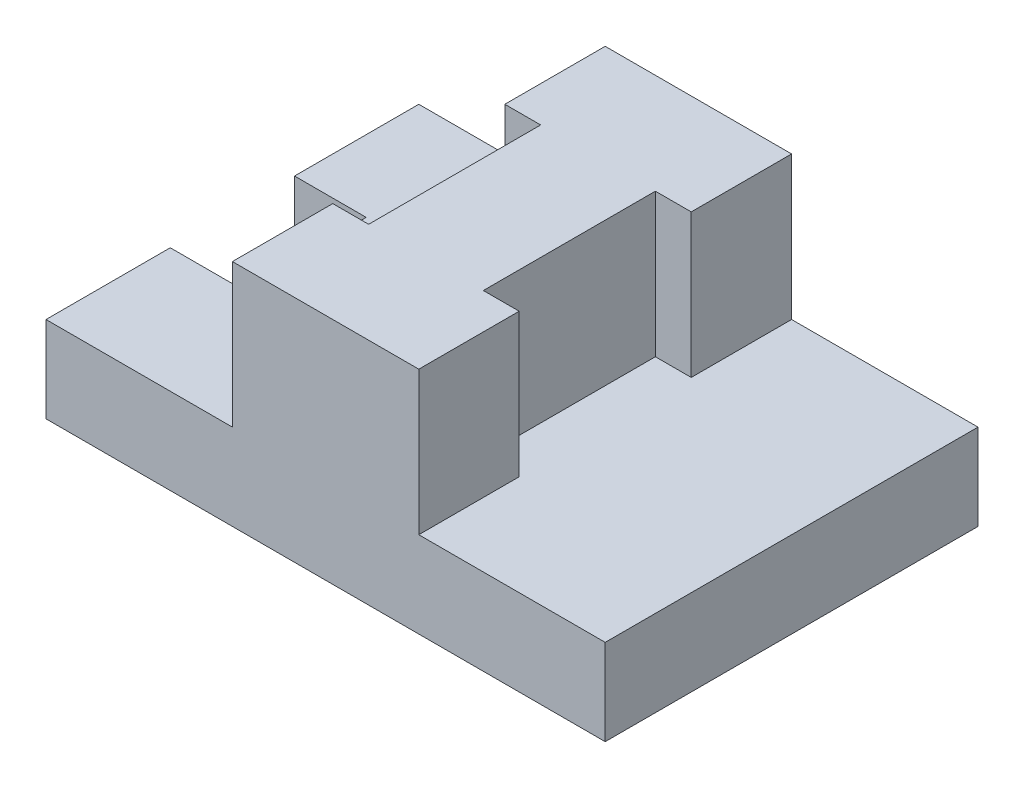
ISO-10303-21;
HEADER;
FILE_DESCRIPTION(('STEP AP214'),'2;1');
FILE_NAME('part.step','',(''),(''),'','','');
FILE_SCHEMA(('AUTOMOTIVE_DESIGN { 1 0 10303 214 1 1 1 1 }'));
ENDSEC;
DATA;
#1=APPLICATION_CONTEXT('core data for automotive mechanical design processes');
#2=APPLICATION_PROTOCOL_DEFINITION('international standard','automotive_design',2000,#1);
#3=PRODUCT_CONTEXT('',#1,'mechanical');
#4=PRODUCT('Part','Part','',(#3));
#5=PRODUCT_RELATED_PRODUCT_CATEGORY('part','',(#4));
#6=PRODUCT_DEFINITION_FORMATION('','',#4);
#7=PRODUCT_DEFINITION_CONTEXT('part definition',#1,'design');
#8=PRODUCT_DEFINITION('design','',#6,#7);
#9=PRODUCT_DEFINITION_SHAPE('','',#8);
#10=(LENGTH_UNIT() NAMED_UNIT(*) SI_UNIT(.MILLI.,.METRE.));
#11=(NAMED_UNIT(*) PLANE_ANGLE_UNIT() SI_UNIT($,.RADIAN.));
#12=(NAMED_UNIT(*) SI_UNIT($,.STERADIAN.) SOLID_ANGLE_UNIT());
#13=UNCERTAINTY_MEASURE_WITH_UNIT(LENGTH_MEASURE(1.E-05),#10,'distance_accuracy_value','');
#14=(GEOMETRIC_REPRESENTATION_CONTEXT(3) GLOBAL_UNCERTAINTY_ASSIGNED_CONTEXT((#13)) GLOBAL_UNIT_ASSIGNED_CONTEXT((#10,
#11,#12)) REPRESENTATION_CONTEXT('',''));
#15=CARTESIAN_POINT('',(0.,0.,0.));
#16=DIRECTION('',(0.,0.,1.));
#17=DIRECTION('',(1.,0.,0.));
#18=AXIS2_PLACEMENT_3D('',#15,#16,#17);
#19=CARTESIAN_POINT('',(0.,12.,-29.9759975651244));
#20=DIRECTION('',(0.,0.,1.));
#21=DIRECTION('',(1.,0.,0.));
#22=AXIS2_PLACEMENT_3D('',#19,#20,#21);
#23=PLANE('',#22);
#24=DIRECTION('',(-1.,0.,0.));
#25=VECTOR('',#24,1.);
#26=CARTESIAN_POINT('',(0.,0.,-29.9759975651244));
#27=LINE('',#26,#25);
#28=CARTESIAN_POINT('',(25.2402240596929,0.,-29.9759975651244));
#29=VERTEX_POINT('',#28);
#30=CARTESIAN_POINT('',(-52.7597759403071,0.,-29.9759975651244));
#31=VERTEX_POINT('',#30);
#32=EDGE_CURVE('E307',#29,#31,#27,.T.);
#33=ORIENTED_EDGE('',*,*,#32,.T.);
#34=DIRECTION('',(0.,-1.,0.));
#35=VECTOR('',#34,1.);
#36=CARTESIAN_POINT('',(-52.7597759403071,12.,-29.9759975651244));
#37=LINE('',#36,#35);
#38=CARTESIAN_POINT('',(-52.7597759403071,12.,-29.9759975651244));
#39=VERTEX_POINT('',#38);
#40=EDGE_CURVE('E11',#39,#31,#37,.T.);
#41=ORIENTED_EDGE('',*,*,#40,.F.);
#42=DIRECTION('',(-1.,0.,0.));
#43=VECTOR('',#42,1.);
#44=CARTESIAN_POINT('',(0.,12.,-29.9759975651244));
#45=LINE('',#44,#43);
#46=CARTESIAN_POINT('',(-26.7597759403071,12.,-29.9759975651244));
#47=VERTEX_POINT('',#46);
#48=EDGE_CURVE('E314',#47,#39,#45,.T.);
#49=ORIENTED_EDGE('',*,*,#48,.F.);
#50=DIRECTION('',(0.,-1.,0.));
#51=VECTOR('',#50,1.);
#52=CARTESIAN_POINT('',(-26.7597759403071,32.,-29.9759975651244));
#53=LINE('',#52,#51);
#54=CARTESIAN_POINT('',(-26.7597759403071,32.,-29.9759975651244));
#55=VERTEX_POINT('',#54);
#56=EDGE_CURVE('E297',#55,#47,#53,.T.);
#57=ORIENTED_EDGE('',*,*,#56,.F.);
#58=DIRECTION('',(-1.,0.,0.));
#59=VECTOR('',#58,1.);
#60=CARTESIAN_POINT('',(0.,32.,-29.9759975651244));
#61=LINE('',#60,#59);
#62=CARTESIAN_POINT('',(-0.759775940307066,32.,-29.9759975651244));
#63=VERTEX_POINT('',#62);
#64=EDGE_CURVE('E228',#63,#55,#61,.T.);
#65=ORIENTED_EDGE('',*,*,#64,.F.);
#66=DIRECTION('',(0.,-1.,0.));
#67=VECTOR('',#66,1.);
#68=CARTESIAN_POINT('',(-0.759775940307066,32.,-29.9759975651244));
#69=LINE('',#68,#67);
#70=CARTESIAN_POINT('',(-0.759775940307066,12.,-29.9759975651244));
#71=VERTEX_POINT('',#70);
#72=EDGE_CURVE('E301',#63,#71,#69,.T.);
#73=ORIENTED_EDGE('',*,*,#72,.T.);
#74=DIRECTION('',(-1.,0.,0.));
#75=VECTOR('',#74,1.);
#76=CARTESIAN_POINT('',(0.,12.,-29.9759975651244));
#77=LINE('',#76,#75);
#78=CARTESIAN_POINT('',(25.2402240596929,12.,-29.9759975651244));
#79=VERTEX_POINT('',#78);
#80=EDGE_CURVE('E211',#79,#71,#77,.T.);
#81=ORIENTED_EDGE('',*,*,#80,.F.);
#82=DIRECTION('',(0.,-1.,0.));
#83=VECTOR('',#82,1.);
#84=CARTESIAN_POINT('',(25.2402240596929,12.,-29.9759975651244));
#85=LINE('',#84,#83);
#86=EDGE_CURVE('E205',#79,#29,#85,.T.);
#87=ORIENTED_EDGE('',*,*,#86,.T.);
#88=EDGE_LOOP('',(#33,#41,#49,#57,#65,#73,#81,#87));
#89=FACE_BOUND('',#88,.T.);
#90=ADVANCED_FACE('F41',(#89),#23,.F.);
#91=CARTESIAN_POINT('',(-52.7597759403071,12.,0.));
#92=DIRECTION('',(1.,0.,0.));
#93=DIRECTION('',(0.,0.,-1.));
#94=AXIS2_PLACEMENT_3D('',#91,#92,#93);
#95=PLANE('',#94);
#96=DIRECTION('',(0.,0.,1.));
#97=VECTOR('',#96,1.);
#98=CARTESIAN_POINT('',(-52.7597759403071,0.,0.));
#99=LINE('',#98,#97);
#100=CARTESIAN_POINT('',(-52.7597759403071,0.,-12.6426642317911));
#101=VERTEX_POINT('',#100);
#102=EDGE_CURVE('E347',#31,#101,#99,.T.);
#103=ORIENTED_EDGE('',*,*,#102,.T.);
#104=DIRECTION('',(0.,-1.,0.));
#105=VECTOR('',#104,1.);
#106=CARTESIAN_POINT('',(-52.7597759403071,12.,-12.6426642317911));
#107=LINE('',#106,#105);
#108=CARTESIAN_POINT('',(-52.7597759403071,12.,-12.6426642317911));
#109=VERTEX_POINT('',#108);
#110=EDGE_CURVE('E49',#109,#101,#107,.T.);
#111=ORIENTED_EDGE('',*,*,#110,.F.);
#112=DIRECTION('',(0.,0.,1.));
#113=VECTOR('',#112,1.);
#114=CARTESIAN_POINT('',(-52.7597759403071,12.,0.));
#115=LINE('',#114,#113);
#116=EDGE_CURVE('E317',#39,#109,#115,.T.);
#117=ORIENTED_EDGE('',*,*,#116,.F.);
#118=ORIENTED_EDGE('',*,*,#40,.T.);
#119=EDGE_LOOP('',(#103,#111,#117,#118));
#120=FACE_BOUND('',#119,.T.);
#121=ADVANCED_FACE('F407',(#120),#95,.F.);
#122=CARTESIAN_POINT('',(0.,12.,-12.6426642317911));
#123=DIRECTION('',(0.,0.,-1.));
#124=DIRECTION('',(-1.,0.,0.));
#125=AXIS2_PLACEMENT_3D('',#122,#123,#124);
#126=PLANE('',#125);
#127=DIRECTION('',(1.,0.,0.));
#128=VECTOR('',#127,1.);
#129=CARTESIAN_POINT('',(0.,0.,-12.6426642317911));
#130=LINE('',#129,#128);
#131=CARTESIAN_POINT('',(-42.7597759403071,0.,-12.6426642317911));
#132=VERTEX_POINT('',#131);
#133=EDGE_CURVE('E350',#101,#132,#130,.T.);
#134=ORIENTED_EDGE('',*,*,#133,.T.);
#135=DIRECTION('',(0.,-1.,0.));
#136=VECTOR('',#135,1.);
#137=CARTESIAN_POINT('',(-42.7597759403071,12.,-12.6426642317911));
#138=LINE('',#137,#136);
#139=CARTESIAN_POINT('',(-42.7597759403071,12.,-12.6426642317911));
#140=VERTEX_POINT('',#139);
#141=EDGE_CURVE('E374',#140,#132,#138,.T.);
#142=ORIENTED_EDGE('',*,*,#141,.F.);
#143=DIRECTION('',(1.,0.,0.));
#144=VECTOR('',#143,1.);
#145=CARTESIAN_POINT('',(0.,12.,-12.6426642317911));
#146=LINE('',#145,#144);
#147=EDGE_CURVE('E320',#109,#140,#146,.T.);
#148=ORIENTED_EDGE('',*,*,#147,.F.);
#149=ORIENTED_EDGE('',*,*,#110,.T.);
#150=EDGE_LOOP('',(#134,#142,#148,#149));
#151=FACE_BOUND('',#150,.T.);
#152=ADVANCED_FACE('F383',(#151),#126,.F.);
#153=CARTESIAN_POINT('',(-42.7597759403071,12.,0.));
#154=DIRECTION('',(1.,0.,0.));
#155=DIRECTION('',(0.,0.,-1.));
#156=AXIS2_PLACEMENT_3D('',#153,#154,#155);
#157=PLANE('',#156);
#158=DIRECTION('',(0.,0.,1.));
#159=VECTOR('',#158,1.);
#160=CARTESIAN_POINT('',(-42.7597759403071,0.,0.));
#161=LINE('',#160,#159);
#162=CARTESIAN_POINT('',(-42.7597759403071,0.,4.69066910154227));
#163=VERTEX_POINT('',#162);
#164=EDGE_CURVE('E353',#132,#163,#161,.T.);
#165=ORIENTED_EDGE('',*,*,#164,.T.);
#166=DIRECTION('',(0.,-1.,0.));
#167=VECTOR('',#166,1.);
#168=CARTESIAN_POINT('',(-42.7597759403071,12.,4.69066910154227));
#169=LINE('',#168,#167);
#170=CARTESIAN_POINT('',(-42.7597759403071,12.,4.69066910154227));
#171=VERTEX_POINT('',#170);
#172=EDGE_CURVE('E370',#171,#163,#169,.T.);
#173=ORIENTED_EDGE('',*,*,#172,.F.);
#174=DIRECTION('',(0.,0.,1.));
#175=VECTOR('',#174,1.);
#176=CARTESIAN_POINT('',(-42.7597759403071,12.,0.));
#177=LINE('',#176,#175);
#178=EDGE_CURVE('E323',#140,#171,#177,.T.);
#179=ORIENTED_EDGE('',*,*,#178,.F.);
#180=ORIENTED_EDGE('',*,*,#141,.T.);
#181=EDGE_LOOP('',(#165,#173,#179,#180));
#182=FACE_BOUND('',#181,.T.);
#183=ADVANCED_FACE('F395',(#182),#157,.F.);
#184=CARTESIAN_POINT('',(0.,12.,4.69066910154227));
#185=DIRECTION('',(0.,0.,1.));
#186=DIRECTION('',(1.,0.,0.));
#187=AXIS2_PLACEMENT_3D('',#184,#185,#186);
#188=PLANE('',#187);
#189=DIRECTION('',(-1.,0.,0.));
#190=VECTOR('',#189,1.);
#191=CARTESIAN_POINT('',(0.,0.,4.69066910154227));
#192=LINE('',#191,#190);
#193=CARTESIAN_POINT('',(-52.7597759403071,0.,4.69066910154227));
#194=VERTEX_POINT('',#193);
#195=EDGE_CURVE('E356',#163,#194,#192,.T.);
#196=ORIENTED_EDGE('',*,*,#195,.T.);
#197=DIRECTION('',(0.,-1.,0.));
#198=VECTOR('',#197,1.);
#199=CARTESIAN_POINT('',(-52.7597759403071,12.,4.69066910154227));
#200=LINE('',#199,#198);
#201=CARTESIAN_POINT('',(-52.7597759403071,12.,4.69066910154227));
#202=VERTEX_POINT('',#201);
#203=EDGE_CURVE('E366',#202,#194,#200,.T.);
#204=ORIENTED_EDGE('',*,*,#203,.F.);
#205=DIRECTION('',(-1.,0.,0.));
#206=VECTOR('',#205,1.);
#207=CARTESIAN_POINT('',(0.,12.,4.69066910154227));
#208=LINE('',#207,#206);
#209=EDGE_CURVE('E326',#171,#202,#208,.T.);
#210=ORIENTED_EDGE('',*,*,#209,.F.);
#211=ORIENTED_EDGE('',*,*,#172,.T.);
#212=EDGE_LOOP('',(#196,#204,#210,#211));
#213=FACE_BOUND('',#212,.T.);
#214=ADVANCED_FACE('F399',(#213),#188,.F.);
#215=CARTESIAN_POINT('',(-52.7597759403071,12.,0.));
#216=DIRECTION('',(1.,0.,0.));
#217=DIRECTION('',(0.,0.,-1.));
#218=AXIS2_PLACEMENT_3D('',#215,#216,#217);
#219=PLANE('',#218);
#220=DIRECTION('',(0.,0.,1.));
#221=VECTOR('',#220,1.);
#222=CARTESIAN_POINT('',(-52.7597759403071,0.,0.));
#223=LINE('',#222,#221);
#224=CARTESIAN_POINT('',(-52.7597759403071,0.,22.0240024348756));
#225=VERTEX_POINT('',#224);
#226=EDGE_CURVE('E359',#194,#225,#223,.T.);
#227=ORIENTED_EDGE('',*,*,#226,.T.);
#228=DIRECTION('',(0.,-1.,0.));
#229=VECTOR('',#228,1.);
#230=CARTESIAN_POINT('',(-52.7597759403071,12.,22.0240024348756));
#231=LINE('',#230,#229);
#232=CARTESIAN_POINT('',(-52.7597759403071,12.,22.0240024348756));
#233=VERTEX_POINT('',#232);
#234=EDGE_CURVE('E344',#233,#225,#231,.T.);
#235=ORIENTED_EDGE('',*,*,#234,.F.);
#236=DIRECTION('',(0.,0.,1.));
#237=VECTOR('',#236,1.);
#238=CARTESIAN_POINT('',(-52.7597759403071,12.,0.));
#239=LINE('',#238,#237);
#240=EDGE_CURVE('E329',#202,#233,#239,.T.);
#241=ORIENTED_EDGE('',*,*,#240,.F.);
#242=ORIENTED_EDGE('',*,*,#203,.T.);
#243=EDGE_LOOP('',(#227,#235,#241,#242));
#244=FACE_BOUND('',#243,.T.);
#245=ADVANCED_FACE('F411',(#244),#219,.F.);
#246=CARTESIAN_POINT('',(0.,12.,22.0240024348756));
#247=DIRECTION('',(0.,0.,-1.));
#248=DIRECTION('',(-1.,0.,0.));
#249=AXIS2_PLACEMENT_3D('',#246,#247,#248);
#250=PLANE('',#249);
#251=DIRECTION('',(1.,0.,0.));
#252=VECTOR('',#251,1.);
#253=CARTESIAN_POINT('',(0.,0.,22.0240024348756));
#254=LINE('',#253,#252);
#255=CARTESIAN_POINT('',(25.2402240596929,0.,22.0240024348756));
#256=VERTEX_POINT('',#255);
#257=EDGE_CURVE('E199',#225,#256,#254,.T.);
#258=ORIENTED_EDGE('',*,*,#257,.T.);
#259=DIRECTION('',(0.,-1.,0.));
#260=VECTOR('',#259,1.);
#261=CARTESIAN_POINT('',(25.2402240596929,12.,22.0240024348756));
#262=LINE('',#261,#260);
#263=CARTESIAN_POINT('',(25.2402240596929,12.,22.0240024348756));
#264=VERTEX_POINT('',#263);
#265=EDGE_CURVE('E195',#264,#256,#262,.T.);
#266=ORIENTED_EDGE('',*,*,#265,.F.);
#267=DIRECTION('',(1.,0.,0.));
#268=VECTOR('',#267,1.);
#269=CARTESIAN_POINT('',(0.,12.,22.0240024348756));
#270=LINE('',#269,#268);
#271=CARTESIAN_POINT('',(-0.759775940307066,12.,22.0240024348756));
#272=VERTEX_POINT('',#271);
#273=EDGE_CURVE('E181',#272,#264,#270,.T.);
#274=ORIENTED_EDGE('',*,*,#273,.F.);
#275=DIRECTION('',(0.,-1.,0.));
#276=VECTOR('',#275,1.);
#277=CARTESIAN_POINT('',(-0.759775940307066,32.,22.0240024348756));
#278=LINE('',#277,#276);
#279=CARTESIAN_POINT('',(-0.759775940307066,32.,22.0240024348756));
#280=VERTEX_POINT('',#279);
#281=EDGE_CURVE('E274',#280,#272,#278,.T.);
#282=ORIENTED_EDGE('',*,*,#281,.F.);
#283=DIRECTION('',(1.,0.,0.));
#284=VECTOR('',#283,1.);
#285=CARTESIAN_POINT('',(0.,32.,22.0240024348756));
#286=LINE('',#285,#284);
#287=CARTESIAN_POINT('',(-26.7597759403071,32.,22.0240024348756));
#288=VERTEX_POINT('',#287);
#289=EDGE_CURVE('E251',#288,#280,#286,.T.);
#290=ORIENTED_EDGE('',*,*,#289,.F.);
#291=DIRECTION('',(0.,-1.,0.));
#292=VECTOR('',#291,1.);
#293=CARTESIAN_POINT('',(-26.7597759403071,32.,22.0240024348756));
#294=LINE('',#293,#292);
#295=CARTESIAN_POINT('',(-26.7597759403071,12.,22.0240024348756));
#296=VERTEX_POINT('',#295);
#297=EDGE_CURVE('E277',#288,#296,#294,.T.);
#298=ORIENTED_EDGE('',*,*,#297,.T.);
#299=DIRECTION('',(1.,0.,0.));
#300=VECTOR('',#299,1.);
#301=CARTESIAN_POINT('',(0.,12.,22.0240024348756));
#302=LINE('',#301,#300);
#303=EDGE_CURVE('E332',#233,#296,#302,.T.);
#304=ORIENTED_EDGE('',*,*,#303,.F.);
#305=ORIENTED_EDGE('',*,*,#234,.T.);
#306=EDGE_LOOP('',(#258,#266,#274,#282,#290,#298,#304,#305));
#307=FACE_BOUND('',#306,.T.);
#308=ADVANCED_FACE('F196',(#307),#250,.F.);
#309=CARTESIAN_POINT('',(0.,12.,0.));
#310=DIRECTION('',(0.,1.,0.));
#311=DIRECTION('',(0.,0.,1.));
#312=AXIS2_PLACEMENT_3D('',#309,#310,#311);
#313=PLANE('',#312);
#314=DIRECTION('',(-1.,0.,0.));
#315=VECTOR('',#314,1.);
#316=CARTESIAN_POINT('',(0.,12.,-15.9759975651244));
#317=LINE('',#316,#315);
#318=CARTESIAN_POINT('',(-21.7597759403071,12.,-15.9759975651244));
#319=VERTEX_POINT('',#318);
#320=CARTESIAN_POINT('',(-26.7597759403071,12.,-15.9759975651244));
#321=VERTEX_POINT('',#320);
#322=EDGE_CURVE('E308',#319,#321,#317,.T.);
#323=ORIENTED_EDGE('',*,*,#322,.T.);
#324=DIRECTION('',(0.,0.,-1.));
#325=VECTOR('',#324,1.);
#326=CARTESIAN_POINT('',(-26.7597759403071,12.,0.));
#327=LINE('',#326,#325);
#328=EDGE_CURVE('E311',#321,#47,#327,.T.);
#329=ORIENTED_EDGE('',*,*,#328,.T.);
#330=ORIENTED_EDGE('',*,*,#48,.T.);
#331=ORIENTED_EDGE('',*,*,#116,.T.);
#332=ORIENTED_EDGE('',*,*,#147,.T.);
#333=ORIENTED_EDGE('',*,*,#178,.T.);
#334=ORIENTED_EDGE('',*,*,#209,.T.);
#335=ORIENTED_EDGE('',*,*,#240,.T.);
#336=ORIENTED_EDGE('',*,*,#303,.T.);
#337=DIRECTION('',(0.,0.,-1.));
#338=VECTOR('',#337,1.);
#339=CARTESIAN_POINT('',(-26.7597759403071,12.,0.));
#340=LINE('',#339,#338);
#341=CARTESIAN_POINT('',(-26.7597759403071,12.,8.0240024348756));
#342=VERTEX_POINT('',#341);
#343=EDGE_CURVE('E335',#296,#342,#340,.T.);
#344=ORIENTED_EDGE('',*,*,#343,.T.);
#345=DIRECTION('',(1.,0.,0.));
#346=VECTOR('',#345,1.);
#347=CARTESIAN_POINT('',(0.,12.,8.0240024348756));
#348=LINE('',#347,#346);
#349=CARTESIAN_POINT('',(-21.7597759403071,12.,8.0240024348756));
#350=VERTEX_POINT('',#349);
#351=EDGE_CURVE('E338',#342,#350,#348,.T.);
#352=ORIENTED_EDGE('',*,*,#351,.T.);
#353=DIRECTION('',(0.,0.,-1.));
#354=VECTOR('',#353,1.);
#355=CARTESIAN_POINT('',(-21.7597759403071,12.,0.));
#356=LINE('',#355,#354);
#357=EDGE_CURVE('E341',#350,#319,#356,.T.);
#358=ORIENTED_EDGE('',*,*,#357,.T.);
#359=EDGE_LOOP('',(#323,#329,#330,#331,#332,#333,#334,#335,#336,#344,#352,#358));
#360=FACE_BOUND('',#359,.T.);
#361=ADVANCED_FACE('F403',(#360),#313,.T.);
#362=CARTESIAN_POINT('',(0.,0.,0.));
#363=DIRECTION('',(0.,1.,0.));
#364=DIRECTION('',(0.,0.,1.));
#365=AXIS2_PLACEMENT_3D('',#362,#363,#364);
#366=PLANE('',#365);
#367=ORIENTED_EDGE('',*,*,#32,.F.);
#368=DIRECTION('',(0.,0.,-1.));
#369=VECTOR('',#368,1.);
#370=CARTESIAN_POINT('',(25.2402240596929,0.,0.));
#371=LINE('',#370,#369);
#372=EDGE_CURVE('E217',#256,#29,#371,.T.);
#373=ORIENTED_EDGE('',*,*,#372,.F.);
#374=ORIENTED_EDGE('',*,*,#257,.F.);
#375=ORIENTED_EDGE('',*,*,#226,.F.);
#376=ORIENTED_EDGE('',*,*,#195,.F.);
#377=ORIENTED_EDGE('',*,*,#164,.F.);
#378=ORIENTED_EDGE('',*,*,#133,.F.);
#379=ORIENTED_EDGE('',*,*,#102,.F.);
#380=EDGE_LOOP('',(#367,#373,#374,#375,#376,#377,#378,#379));
#381=FACE_BOUND('',#380,.T.);
#382=ADVANCED_FACE('F390',(#381),#366,.F.);
#383=CARTESIAN_POINT('',(0.,32.,-15.9759975651244));
#384=DIRECTION('',(0.,0.,-1.));
#385=DIRECTION('',(-1.,0.,0.));
#386=AXIS2_PLACEMENT_3D('',#383,#384,#385);
#387=PLANE('',#386);
#388=DIRECTION('',(0.,-1.,0.));
#389=VECTOR('',#388,1.);
#390=CARTESIAN_POINT('',(-5.75977594030707,32.,-15.9759975651244));
#391=LINE('',#390,#389);
#392=CARTESIAN_POINT('',(-5.75977594030707,32.,-15.9759975651244));
#393=VERTEX_POINT('',#392);
#394=CARTESIAN_POINT('',(-5.75977594030707,12.,-15.9759975651244));
#395=VERTEX_POINT('',#394);
#396=EDGE_CURVE('E263',#393,#395,#391,.T.);
#397=ORIENTED_EDGE('',*,*,#396,.T.);
#398=DIRECTION('',(1.,0.,0.));
#399=VECTOR('',#398,1.);
#400=CARTESIAN_POINT('',(0.,12.,-15.9759975651244));
#401=LINE('',#400,#399);
#402=CARTESIAN_POINT('',(-0.759775940307066,12.,-15.9759975651244));
#403=VERTEX_POINT('',#402);
#404=EDGE_CURVE('E56',#395,#403,#401,.T.);
#405=ORIENTED_EDGE('',*,*,#404,.T.);
#406=DIRECTION('',(0.,-1.,0.));
#407=VECTOR('',#406,1.);
#408=CARTESIAN_POINT('',(-0.759775940307066,32.,-15.9759975651244));
#409=LINE('',#408,#407);
#410=CARTESIAN_POINT('',(-0.759775940307066,32.,-15.9759975651244));
#411=VERTEX_POINT('',#410);
#412=EDGE_CURVE('E304',#411,#403,#409,.T.);
#413=ORIENTED_EDGE('',*,*,#412,.F.);
#414=DIRECTION('',(1.,0.,0.));
#415=VECTOR('',#414,1.);
#416=CARTESIAN_POINT('',(0.,32.,-15.9759975651244));
#417=LINE('',#416,#415);
#418=EDGE_CURVE('E204',#393,#411,#417,.T.);
#419=ORIENTED_EDGE('',*,*,#418,.F.);
#420=EDGE_LOOP('',(#397,#405,#413,#419));
#421=FACE_BOUND('',#420,.T.);
#422=ADVANCED_FACE('F462',(#421),#387,.F.);
#423=CARTESIAN_POINT('',(-0.759775940307066,32.,0.));
#424=DIRECTION('',(-1.,0.,0.));
#425=DIRECTION('',(0.,0.,1.));
#426=AXIS2_PLACEMENT_3D('',#423,#424,#425);
#427=PLANE('',#426);
#428=ORIENTED_EDGE('',*,*,#412,.T.);
#429=DIRECTION('',(0.,0.,-1.));
#430=VECTOR('',#429,1.);
#431=CARTESIAN_POINT('',(-0.759775940307066,12.,0.));
#432=LINE('',#431,#430);
#433=EDGE_CURVE('E63',#403,#71,#432,.T.);
#434=ORIENTED_EDGE('',*,*,#433,.T.);
#435=ORIENTED_EDGE('',*,*,#72,.F.);
#436=DIRECTION('',(0.,0.,-1.));
#437=VECTOR('',#436,1.);
#438=CARTESIAN_POINT('',(-0.759775940307066,32.,0.));
#439=LINE('',#438,#437);
#440=EDGE_CURVE('E225',#411,#63,#439,.T.);
#441=ORIENTED_EDGE('',*,*,#440,.F.);
#442=EDGE_LOOP('',(#428,#434,#435,#441));
#443=FACE_BOUND('',#442,.T.);
#444=ADVANCED_FACE('F463',(#443),#427,.F.);
#445=CARTESIAN_POINT('',(-26.7597759403071,32.,0.));
#446=DIRECTION('',(-1.,0.,0.));
#447=DIRECTION('',(0.,0.,1.));
#448=AXIS2_PLACEMENT_3D('',#445,#446,#447);
#449=PLANE('',#448);
#450=ORIENTED_EDGE('',*,*,#56,.T.);
#451=ORIENTED_EDGE('',*,*,#328,.F.);
#452=DIRECTION('',(0.,-1.,0.));
#453=VECTOR('',#452,1.);
#454=CARTESIAN_POINT('',(-26.7597759403071,32.,-15.9759975651244));
#455=LINE('',#454,#453);
#456=CARTESIAN_POINT('',(-26.7597759403071,32.,-15.9759975651244));
#457=VERTEX_POINT('',#456);
#458=EDGE_CURVE('E293',#457,#321,#455,.T.);
#459=ORIENTED_EDGE('',*,*,#458,.F.);
#460=DIRECTION('',(0.,0.,-1.));
#461=VECTOR('',#460,1.);
#462=CARTESIAN_POINT('',(-26.7597759403071,32.,0.));
#463=LINE('',#462,#461);
#464=EDGE_CURVE('E231',#457,#55,#463,.T.);
#465=ORIENTED_EDGE('',*,*,#464,.T.);
#466=EDGE_LOOP('',(#450,#451,#459,#465));
#467=FACE_BOUND('',#466,.T.);
#468=ADVANCED_FACE('F435',(#467),#449,.T.);
#469=CARTESIAN_POINT('',(0.,32.,-15.9759975651244));
#470=DIRECTION('',(0.,0.,1.));
#471=DIRECTION('',(1.,0.,0.));
#472=AXIS2_PLACEMENT_3D('',#469,#470,#471);
#473=PLANE('',#472);
#474=ORIENTED_EDGE('',*,*,#458,.T.);
#475=ORIENTED_EDGE('',*,*,#322,.F.);
#476=DIRECTION('',(0.,-1.,0.));
#477=VECTOR('',#476,1.);
#478=CARTESIAN_POINT('',(-21.7597759403071,32.,-15.9759975651244));
#479=LINE('',#478,#477);
#480=CARTESIAN_POINT('',(-21.7597759403071,32.,-15.9759975651244));
#481=VERTEX_POINT('',#480);
#482=EDGE_CURVE('E289',#481,#319,#479,.T.);
#483=ORIENTED_EDGE('',*,*,#482,.F.);
#484=DIRECTION('',(-1.,0.,0.));
#485=VECTOR('',#484,1.);
#486=CARTESIAN_POINT('',(0.,32.,-15.9759975651244));
#487=LINE('',#486,#485);
#488=EDGE_CURVE('E235',#481,#457,#487,.T.);
#489=ORIENTED_EDGE('',*,*,#488,.T.);
#490=EDGE_LOOP('',(#474,#475,#483,#489));
#491=FACE_BOUND('',#490,.T.);
#492=ADVANCED_FACE('F433',(#491),#473,.T.);
#493=CARTESIAN_POINT('',(-21.7597759403071,32.,0.));
#494=DIRECTION('',(-1.,0.,0.));
#495=DIRECTION('',(0.,0.,1.));
#496=AXIS2_PLACEMENT_3D('',#493,#494,#495);
#497=PLANE('',#496);
#498=ORIENTED_EDGE('',*,*,#482,.T.);
#499=ORIENTED_EDGE('',*,*,#357,.F.);
#500=DIRECTION('',(0.,-1.,0.));
#501=VECTOR('',#500,1.);
#502=CARTESIAN_POINT('',(-21.7597759403071,32.,8.0240024348756));
#503=LINE('',#502,#501);
#504=CARTESIAN_POINT('',(-21.7597759403071,32.,8.0240024348756));
#505=VERTEX_POINT('',#504);
#506=EDGE_CURVE('E285',#505,#350,#503,.T.);
#507=ORIENTED_EDGE('',*,*,#506,.F.);
#508=DIRECTION('',(0.,0.,-1.));
#509=VECTOR('',#508,1.);
#510=CARTESIAN_POINT('',(-21.7597759403071,32.,0.));
#511=LINE('',#510,#509);
#512=EDGE_CURVE('E239',#505,#481,#511,.T.);
#513=ORIENTED_EDGE('',*,*,#512,.T.);
#514=EDGE_LOOP('',(#498,#499,#507,#513));
#515=FACE_BOUND('',#514,.T.);
#516=ADVANCED_FACE('F428',(#515),#497,.T.);
#517=CARTESIAN_POINT('',(0.,32.,8.0240024348756));
#518=DIRECTION('',(0.,0.,-1.));
#519=DIRECTION('',(-1.,0.,0.));
#520=AXIS2_PLACEMENT_3D('',#517,#518,#519);
#521=PLANE('',#520);
#522=ORIENTED_EDGE('',*,*,#506,.T.);
#523=ORIENTED_EDGE('',*,*,#351,.F.);
#524=DIRECTION('',(0.,-1.,0.));
#525=VECTOR('',#524,1.);
#526=CARTESIAN_POINT('',(-26.7597759403071,32.,8.0240024348756));
#527=LINE('',#526,#525);
#528=CARTESIAN_POINT('',(-26.7597759403071,32.,8.0240024348756));
#529=VERTEX_POINT('',#528);
#530=EDGE_CURVE('E281',#529,#342,#527,.T.);
#531=ORIENTED_EDGE('',*,*,#530,.F.);
#532=DIRECTION('',(1.,0.,0.));
#533=VECTOR('',#532,1.);
#534=CARTESIAN_POINT('',(0.,32.,8.0240024348756));
#535=LINE('',#534,#533);
#536=EDGE_CURVE('E243',#529,#505,#535,.T.);
#537=ORIENTED_EDGE('',*,*,#536,.T.);
#538=EDGE_LOOP('',(#522,#523,#531,#537));
#539=FACE_BOUND('',#538,.T.);
#540=ADVANCED_FACE('F421',(#539),#521,.T.);
#541=CARTESIAN_POINT('',(-26.7597759403071,32.,0.));
#542=DIRECTION('',(-1.,0.,0.));
#543=DIRECTION('',(0.,0.,1.));
#544=AXIS2_PLACEMENT_3D('',#541,#542,#543);
#545=PLANE('',#544);
#546=ORIENTED_EDGE('',*,*,#530,.T.);
#547=ORIENTED_EDGE('',*,*,#343,.F.);
#548=ORIENTED_EDGE('',*,*,#297,.F.);
#549=DIRECTION('',(0.,0.,-1.));
#550=VECTOR('',#549,1.);
#551=CARTESIAN_POINT('',(-26.7597759403071,32.,0.));
#552=LINE('',#551,#550);
#553=EDGE_CURVE('E247',#288,#529,#552,.T.);
#554=ORIENTED_EDGE('',*,*,#553,.T.);
#555=EDGE_LOOP('',(#546,#547,#548,#554));
#556=FACE_BOUND('',#555,.T.);
#557=ADVANCED_FACE('F417',(#556),#545,.T.);
#558=CARTESIAN_POINT('',(-0.759775940307066,32.,0.));
#559=DIRECTION('',(-1.,0.,0.));
#560=DIRECTION('',(0.,0.,1.));
#561=AXIS2_PLACEMENT_3D('',#558,#559,#560);
#562=PLANE('',#561);
#563=ORIENTED_EDGE('',*,*,#281,.T.);
#564=DIRECTION('',(0.,0.,-1.));
#565=VECTOR('',#564,1.);
#566=CARTESIAN_POINT('',(-0.759775940307066,12.,0.));
#567=LINE('',#566,#565);
#568=CARTESIAN_POINT('',(-0.759775940307066,12.,8.0240024348756));
#569=VERTEX_POINT('',#568);
#570=EDGE_CURVE('E189',#272,#569,#567,.T.);
#571=ORIENTED_EDGE('',*,*,#570,.T.);
#572=DIRECTION('',(0.,-1.,0.));
#573=VECTOR('',#572,1.);
#574=CARTESIAN_POINT('',(-0.759775940307066,32.,8.0240024348756));
#575=LINE('',#574,#573);
#576=CARTESIAN_POINT('',(-0.759775940307066,32.,8.0240024348756));
#577=VERTEX_POINT('',#576);
#578=EDGE_CURVE('E270',#577,#569,#575,.T.);
#579=ORIENTED_EDGE('',*,*,#578,.F.);
#580=DIRECTION('',(0.,0.,-1.));
#581=VECTOR('',#580,1.);
#582=CARTESIAN_POINT('',(-0.759775940307066,32.,0.));
#583=LINE('',#582,#581);
#584=EDGE_CURVE('E254',#280,#577,#583,.T.);
#585=ORIENTED_EDGE('',*,*,#584,.F.);
#586=EDGE_LOOP('',(#563,#571,#579,#585));
#587=FACE_BOUND('',#586,.T.);
#588=ADVANCED_FACE('F451',(#587),#562,.F.);
#589=CARTESIAN_POINT('',(0.,32.,8.0240024348756));
#590=DIRECTION('',(0.,0.,1.));
#591=DIRECTION('',(1.,0.,0.));
#592=AXIS2_PLACEMENT_3D('',#589,#590,#591);
#593=PLANE('',#592);
#594=ORIENTED_EDGE('',*,*,#578,.T.);
#595=DIRECTION('',(-1.,0.,0.));
#596=VECTOR('',#595,1.);
#597=CARTESIAN_POINT('',(0.,12.,8.0240024348756));
#598=LINE('',#597,#596);
#599=CARTESIAN_POINT('',(-5.75977594030707,12.,8.0240024348756));
#600=VERTEX_POINT('',#599);
#601=EDGE_CURVE('E446',#569,#600,#598,.T.);
#602=ORIENTED_EDGE('',*,*,#601,.T.);
#603=DIRECTION('',(0.,-1.,0.));
#604=VECTOR('',#603,1.);
#605=CARTESIAN_POINT('',(-5.75977594030707,32.,8.0240024348756));
#606=LINE('',#605,#604);
#607=CARTESIAN_POINT('',(-5.75977594030707,32.,8.0240024348756));
#608=VERTEX_POINT('',#607);
#609=EDGE_CURVE('E266',#608,#600,#606,.T.);
#610=ORIENTED_EDGE('',*,*,#609,.F.);
#611=DIRECTION('',(-1.,0.,0.));
#612=VECTOR('',#611,1.);
#613=CARTESIAN_POINT('',(0.,32.,8.0240024348756));
#614=LINE('',#613,#612);
#615=EDGE_CURVE('E257',#577,#608,#614,.T.);
#616=ORIENTED_EDGE('',*,*,#615,.F.);
#617=EDGE_LOOP('',(#594,#602,#610,#616));
#618=FACE_BOUND('',#617,.T.);
#619=ADVANCED_FACE('F455',(#618),#593,.F.);
#620=CARTESIAN_POINT('',(-5.75977594030707,32.,0.));
#621=DIRECTION('',(-1.,0.,0.));
#622=DIRECTION('',(0.,0.,1.));
#623=AXIS2_PLACEMENT_3D('',#620,#621,#622);
#624=PLANE('',#623);
#625=ORIENTED_EDGE('',*,*,#609,.T.);
#626=DIRECTION('',(0.,0.,-1.));
#627=VECTOR('',#626,1.);
#628=CARTESIAN_POINT('',(-5.75977594030707,12.,0.));
#629=LINE('',#628,#627);
#630=EDGE_CURVE('E441',#600,#395,#629,.T.);
#631=ORIENTED_EDGE('',*,*,#630,.T.);
#632=ORIENTED_EDGE('',*,*,#396,.F.);
#633=DIRECTION('',(0.,0.,-1.));
#634=VECTOR('',#633,1.);
#635=CARTESIAN_POINT('',(-5.75977594030707,32.,0.));
#636=LINE('',#635,#634);
#637=EDGE_CURVE('E260',#608,#393,#636,.T.);
#638=ORIENTED_EDGE('',*,*,#637,.F.);
#639=EDGE_LOOP('',(#625,#631,#632,#638));
#640=FACE_BOUND('',#639,.T.);
#641=ADVANCED_FACE('F459',(#640),#624,.F.);
#642=CARTESIAN_POINT('',(0.,32.,0.));
#643=DIRECTION('',(0.,1.,0.));
#644=DIRECTION('',(0.,0.,1.));
#645=AXIS2_PLACEMENT_3D('',#642,#643,#644);
#646=PLANE('',#645);
#647=ORIENTED_EDGE('',*,*,#418,.T.);
#648=ORIENTED_EDGE('',*,*,#440,.T.);
#649=ORIENTED_EDGE('',*,*,#64,.T.);
#650=ORIENTED_EDGE('',*,*,#464,.F.);
#651=ORIENTED_EDGE('',*,*,#488,.F.);
#652=ORIENTED_EDGE('',*,*,#512,.F.);
#653=ORIENTED_EDGE('',*,*,#536,.F.);
#654=ORIENTED_EDGE('',*,*,#553,.F.);
#655=ORIENTED_EDGE('',*,*,#289,.T.);
#656=ORIENTED_EDGE('',*,*,#584,.T.);
#657=ORIENTED_EDGE('',*,*,#615,.T.);
#658=ORIENTED_EDGE('',*,*,#637,.T.);
#659=EDGE_LOOP('',(#647,#648,#649,#650,#651,#652,#653,#654,#655,#656,#657,#658));
#660=FACE_BOUND('',#659,.T.);
#661=ADVANCED_FACE('F424',(#660),#646,.T.);
#662=CARTESIAN_POINT('',(25.2402240596929,12.,0.));
#663=DIRECTION('',(-1.,0.,0.));
#664=DIRECTION('',(0.,0.,1.));
#665=AXIS2_PLACEMENT_3D('',#662,#663,#664);
#666=PLANE('',#665);
#667=ORIENTED_EDGE('',*,*,#372,.T.);
#668=ORIENTED_EDGE('',*,*,#86,.F.);
#669=DIRECTION('',(0.,0.,-1.));
#670=VECTOR('',#669,1.);
#671=CARTESIAN_POINT('',(25.2402240596929,12.,0.));
#672=LINE('',#671,#670);
#673=EDGE_CURVE('E186',#264,#79,#672,.T.);
#674=ORIENTED_EDGE('',*,*,#673,.F.);
#675=ORIENTED_EDGE('',*,*,#265,.T.);
#676=EDGE_LOOP('',(#667,#668,#674,#675));
#677=FACE_BOUND('',#676,.T.);
#678=ADVANCED_FACE('F207',(#677),#666,.F.);
#679=CARTESIAN_POINT('',(0.,12.,0.));
#680=DIRECTION('',(0.,1.,0.));
#681=DIRECTION('',(0.,0.,1.));
#682=AXIS2_PLACEMENT_3D('',#679,#680,#681);
#683=PLANE('',#682);
#684=ORIENTED_EDGE('',*,*,#433,.F.);
#685=ORIENTED_EDGE('',*,*,#404,.F.);
#686=ORIENTED_EDGE('',*,*,#630,.F.);
#687=ORIENTED_EDGE('',*,*,#601,.F.);
#688=ORIENTED_EDGE('',*,*,#570,.F.);
#689=ORIENTED_EDGE('',*,*,#273,.T.);
#690=ORIENTED_EDGE('',*,*,#673,.T.);
#691=ORIENTED_EDGE('',*,*,#80,.T.);
#692=EDGE_LOOP('',(#684,#685,#686,#687,#688,#689,#690,#691));
#693=FACE_BOUND('',#692,.T.);
#694=ADVANCED_FACE('F183',(#693),#683,.T.);
#695=CLOSED_SHELL('',(#90,#121,#152,#183,#214,#245,#308,#361,#382,#422,#444,#468,#492,#516,#540,
#557,#588,#619,#641,#661,#678,#694));
#696=MANIFOLD_SOLID_BREP('B2',#695);
#697=ADVANCED_BREP_SHAPE_REPRESENTATION('',(#18,#696),#14);
#698=SHAPE_DEFINITION_REPRESENTATION(#9,#697);
ENDSEC;
END-ISO-10303-21;
